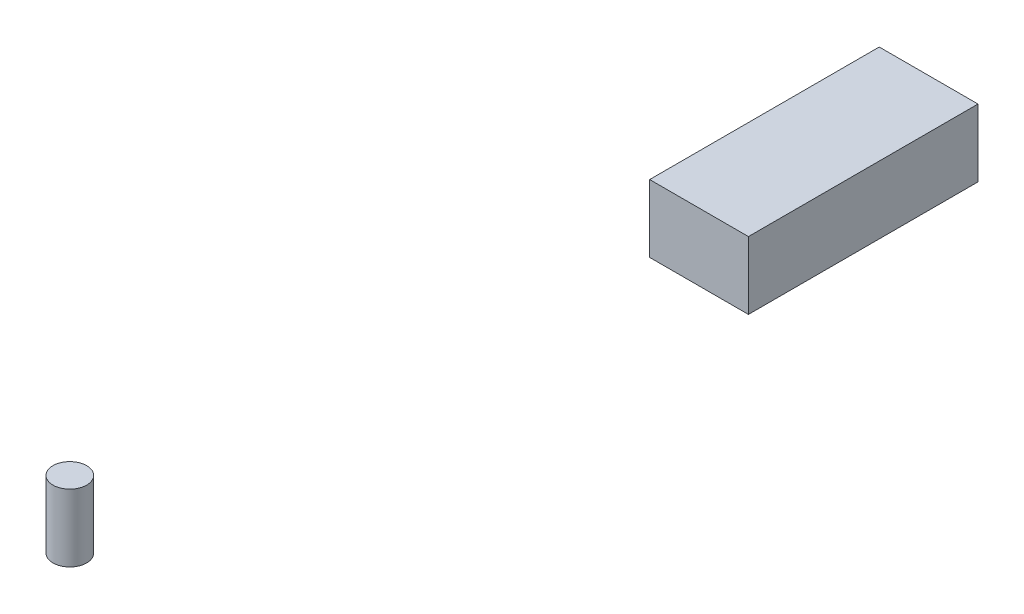
ISO-10303-21;
HEADER;
FILE_DESCRIPTION(('STEP AP214'),'2;1');
FILE_NAME('part.step','',(''),(''),'','','');
FILE_SCHEMA(('AUTOMOTIVE_DESIGN { 1 0 10303 214 1 1 1 1 }'));
ENDSEC;
DATA;
#1=APPLICATION_CONTEXT('core data for automotive mechanical design processes');
#2=APPLICATION_PROTOCOL_DEFINITION('international standard','automotive_design',2000,#1);
#3=PRODUCT_CONTEXT('',#1,'mechanical');
#4=PRODUCT('Part','Part','',(#3));
#5=PRODUCT_RELATED_PRODUCT_CATEGORY('part','',(#4));
#6=PRODUCT_DEFINITION_FORMATION('','',#4);
#7=PRODUCT_DEFINITION_CONTEXT('part definition',#1,'design');
#8=PRODUCT_DEFINITION('design','',#6,#7);
#9=PRODUCT_DEFINITION_SHAPE('','',#8);
#10=(LENGTH_UNIT() NAMED_UNIT(*) SI_UNIT(.MILLI.,.METRE.));
#11=(NAMED_UNIT(*) PLANE_ANGLE_UNIT() SI_UNIT($,.RADIAN.));
#12=(NAMED_UNIT(*) SI_UNIT($,.STERADIAN.) SOLID_ANGLE_UNIT());
#13=UNCERTAINTY_MEASURE_WITH_UNIT(LENGTH_MEASURE(1.E-05),#10,'distance_accuracy_value','');
#14=(GEOMETRIC_REPRESENTATION_CONTEXT(3) GLOBAL_UNCERTAINTY_ASSIGNED_CONTEXT((#13)) GLOBAL_UNIT_ASSIGNED_CONTEXT((#10,
#11,#12)) REPRESENTATION_CONTEXT('',''));
#15=CARTESIAN_POINT('',(0.,0.,0.));
#16=DIRECTION('',(0.,0.,1.));
#17=DIRECTION('',(1.,0.,0.));
#18=AXIS2_PLACEMENT_3D('',#15,#16,#17);
#19=CARTESIAN_POINT('',(19.6415192070973,10.,-114.995004291305));
#20=DIRECTION('',(-1.,0.,0.));
#21=DIRECTION('',(0.,0.,1.));
#22=AXIS2_PLACEMENT_3D('',#19,#20,#21);
#23=PLANE('',#22);
#24=DIRECTION('',(0.,0.,-1.));
#25=VECTOR('',#24,1.);
#26=CARTESIAN_POINT('',(19.6415192070973,0.,-114.995004291305));
#27=LINE('',#26,#25);
#28=CARTESIAN_POINT('',(19.6415192070973,0.,-80.9606812347664));
#29=VERTEX_POINT('',#28);
#30=CARTESIAN_POINT('',(19.6415192070973,0.,-114.995004291305));
#31=VERTEX_POINT('',#30);
#32=EDGE_CURVE('E109',#29,#31,#27,.T.);
#33=ORIENTED_EDGE('',*,*,#32,.T.);
#34=DIRECTION('',(0.,-1.,0.));
#35=VECTOR('',#34,1.);
#36=CARTESIAN_POINT('',(19.6415192070973,10.,-114.995004291305));
#37=LINE('',#36,#35);
#38=CARTESIAN_POINT('',(19.6415192070973,10.,-114.995004291305));
#39=VERTEX_POINT('',#38);
#40=EDGE_CURVE('E12',#39,#31,#37,.T.);
#41=ORIENTED_EDGE('',*,*,#40,.F.);
#42=DIRECTION('',(0.,0.,-1.));
#43=VECTOR('',#42,1.);
#44=CARTESIAN_POINT('',(19.6415192070973,10.,-114.995004291305));
#45=LINE('',#44,#43);
#46=CARTESIAN_POINT('',(19.6415192070973,10.,-80.9606812347664));
#47=VERTEX_POINT('',#46);
#48=EDGE_CURVE('E97',#47,#39,#45,.T.);
#49=ORIENTED_EDGE('',*,*,#48,.F.);
#50=DIRECTION('',(0.,-1.,0.));
#51=VECTOR('',#50,1.);
#52=CARTESIAN_POINT('',(19.6415192070973,10.,-80.9606812347664));
#53=LINE('',#52,#51);
#54=EDGE_CURVE('E105',#47,#29,#53,.T.);
#55=ORIENTED_EDGE('',*,*,#54,.T.);
#56=EDGE_LOOP('',(#33,#41,#49,#55));
#57=FACE_BOUND('',#56,.T.);
#58=ADVANCED_FACE('F46',(#57),#23,.F.);
#59=CARTESIAN_POINT('',(5.,10.,-114.995004291305));
#60=DIRECTION('',(0.,0.,1.));
#61=DIRECTION('',(1.,0.,0.));
#62=AXIS2_PLACEMENT_3D('',#59,#60,#61);
#63=PLANE('',#62);
#64=DIRECTION('',(-1.,0.,0.));
#65=VECTOR('',#64,1.);
#66=CARTESIAN_POINT('',(5.,0.,-114.995004291305));
#67=LINE('',#66,#65);
#68=CARTESIAN_POINT('',(5.,0.,-114.995004291305));
#69=VERTEX_POINT('',#68);
#70=EDGE_CURVE('E101',#31,#69,#67,.T.);
#71=ORIENTED_EDGE('',*,*,#70,.T.);
#72=DIRECTION('',(0.,-1.,0.));
#73=VECTOR('',#72,1.);
#74=CARTESIAN_POINT('',(5.,10.,-114.995004291305));
#75=LINE('',#74,#73);
#76=CARTESIAN_POINT('',(5.,10.,-114.995004291305));
#77=VERTEX_POINT('',#76);
#78=EDGE_CURVE('E54',#77,#69,#75,.T.);
#79=ORIENTED_EDGE('',*,*,#78,.F.);
#80=DIRECTION('',(-1.,0.,0.));
#81=VECTOR('',#80,1.);
#82=CARTESIAN_POINT('',(5.,10.,-114.995004291305));
#83=LINE('',#82,#81);
#84=EDGE_CURVE('E92',#39,#77,#83,.T.);
#85=ORIENTED_EDGE('',*,*,#84,.F.);
#86=ORIENTED_EDGE('',*,*,#40,.T.);
#87=EDGE_LOOP('',(#71,#79,#85,#86));
#88=FACE_BOUND('',#87,.T.);
#89=ADVANCED_FACE('F100',(#88),#63,.F.);
#90=CARTESIAN_POINT('',(5.,10.,-114.995004291305));
#91=DIRECTION('',(1.,0.,0.));
#92=DIRECTION('',(0.,0.,-1.));
#93=AXIS2_PLACEMENT_3D('',#90,#91,#92);
#94=PLANE('',#93);
#95=DIRECTION('',(0.,0.,1.));
#96=VECTOR('',#95,1.);
#97=CARTESIAN_POINT('',(5.,0.,-114.995004291305));
#98=LINE('',#97,#96);
#99=CARTESIAN_POINT('',(5.,0.,-80.9606812347664));
#100=VERTEX_POINT('',#99);
#101=EDGE_CURVE('E79',#69,#100,#98,.T.);
#102=ORIENTED_EDGE('',*,*,#101,.T.);
#103=DIRECTION('',(0.,-1.,0.));
#104=VECTOR('',#103,1.);
#105=CARTESIAN_POINT('',(5.,10.,-80.9606812347664));
#106=LINE('',#105,#104);
#107=CARTESIAN_POINT('',(5.,10.,-80.9606812347664));
#108=VERTEX_POINT('',#107);
#109=EDGE_CURVE('E102',#108,#100,#106,.T.);
#110=ORIENTED_EDGE('',*,*,#109,.F.);
#111=DIRECTION('',(0.,0.,1.));
#112=VECTOR('',#111,1.);
#113=CARTESIAN_POINT('',(5.,10.,-114.995004291305));
#114=LINE('',#113,#112);
#115=EDGE_CURVE('E95',#77,#108,#114,.T.);
#116=ORIENTED_EDGE('',*,*,#115,.F.);
#117=ORIENTED_EDGE('',*,*,#78,.T.);
#118=EDGE_LOOP('',(#102,#110,#116,#117));
#119=FACE_BOUND('',#118,.T.);
#120=ADVANCED_FACE('F103',(#119),#94,.F.);
#121=CARTESIAN_POINT('',(5.,10.,-80.9606812347664));
#122=DIRECTION('',(0.,0.,-1.));
#123=DIRECTION('',(-1.,0.,0.));
#124=AXIS2_PLACEMENT_3D('',#121,#122,#123);
#125=PLANE('',#124);
#126=DIRECTION('',(1.,0.,0.));
#127=VECTOR('',#126,1.);
#128=CARTESIAN_POINT('',(5.,0.,-80.9606812347664));
#129=LINE('',#128,#127);
#130=EDGE_CURVE('E85',#100,#29,#129,.T.);
#131=ORIENTED_EDGE('',*,*,#130,.T.);
#132=ORIENTED_EDGE('',*,*,#54,.F.);
#133=DIRECTION('',(1.,0.,0.));
#134=VECTOR('',#133,1.);
#135=CARTESIAN_POINT('',(5.,10.,-80.9606812347664));
#136=LINE('',#135,#134);
#137=EDGE_CURVE('E62',#108,#47,#136,.T.);
#138=ORIENTED_EDGE('',*,*,#137,.F.);
#139=ORIENTED_EDGE('',*,*,#109,.T.);
#140=EDGE_LOOP('',(#131,#132,#138,#139));
#141=FACE_BOUND('',#140,.T.);
#142=ADVANCED_FACE('F116',(#141),#125,.F.);
#143=CARTESIAN_POINT('',(0.,10.,0.));
#144=DIRECTION('',(0.,1.,0.));
#145=DIRECTION('',(0.,0.,1.));
#146=AXIS2_PLACEMENT_3D('',#143,#144,#145);
#147=PLANE('',#146);
#148=ORIENTED_EDGE('',*,*,#48,.T.);
#149=ORIENTED_EDGE('',*,*,#84,.T.);
#150=ORIENTED_EDGE('',*,*,#115,.T.);
#151=ORIENTED_EDGE('',*,*,#137,.T.);
#152=EDGE_LOOP('',(#148,#149,#150,#151));
#153=FACE_BOUND('',#152,.T.);
#154=ADVANCED_FACE('F93',(#153),#147,.T.);
#155=CARTESIAN_POINT('',(0.,0.,0.));
#156=DIRECTION('',(0.,1.,0.));
#157=DIRECTION('',(0.,0.,1.));
#158=AXIS2_PLACEMENT_3D('',#155,#156,#157);
#159=PLANE('',#158);
#160=ORIENTED_EDGE('',*,*,#32,.F.);
#161=ORIENTED_EDGE('',*,*,#130,.F.);
#162=ORIENTED_EDGE('',*,*,#101,.F.);
#163=ORIENTED_EDGE('',*,*,#70,.F.);
#164=EDGE_LOOP('',(#160,#161,#162,#163));
#165=FACE_BOUND('',#164,.T.);
#166=ADVANCED_FACE('F119',(#165),#159,.F.);
#167=CLOSED_SHELL('',(#58,#89,#120,#142,#154,#166));
#168=MANIFOLD_SOLID_BREP('B2_NOT_SHOWN',#167);
#169=CARTESIAN_POINT('',(0.,10.,0.));
#170=DIRECTION('',(0.,-1.,0.));
#171=DIRECTION('',(0.,0.,-1.));
#172=AXIS2_PLACEMENT_3D('',#169,#170,#171);
#173=CYLINDRICAL_SURFACE('',#172,2.5);
#174=CARTESIAN_POINT('',(0.,10.,0.));
#175=DIRECTION('',(0.,1.,0.));
#176=DIRECTION('',(0.,0.,1.));
#177=AXIS2_PLACEMENT_3D('',#174,#175,#176);
#178=CIRCLE('',#177,2.5);
#179=CARTESIAN_POINT('',(0.,10.,2.5));
#180=VERTEX_POINT('',#179);
#181=EDGE_CURVE('E45',#180,#180,#178,.T.);
#182=ORIENTED_EDGE('',*,*,#181,.F.);
#183=EDGE_LOOP('',(#182));
#184=FACE_BOUND('',#183,.T.);
#185=CARTESIAN_POINT('',(0.,0.,0.));
#186=DIRECTION('',(0.,1.,0.));
#187=DIRECTION('',(0.,0.,1.));
#188=AXIS2_PLACEMENT_3D('',#185,#186,#187);
#189=CIRCLE('',#188,2.5);
#190=CARTESIAN_POINT('',(0.,0.,2.5));
#191=VERTEX_POINT('',#190);
#192=EDGE_CURVE('E172',#191,#191,#189,.T.);
#193=ORIENTED_EDGE('',*,*,#192,.T.);
#194=EDGE_LOOP('',(#193));
#195=FACE_BOUND('',#194,.T.);
#196=ADVANCED_FACE('F169',(#184,#195),#173,.T.);
#197=CARTESIAN_POINT('',(0.,10.,0.));
#198=DIRECTION('',(0.,1.,0.));
#199=DIRECTION('',(0.,0.,1.));
#200=AXIS2_PLACEMENT_3D('',#197,#198,#199);
#201=PLANE('',#200);
#202=ORIENTED_EDGE('',*,*,#181,.T.);
#203=EDGE_LOOP('',(#202));
#204=FACE_BOUND('',#203,.T.);
#205=ADVANCED_FACE('F184',(#204),#201,.T.);
#206=CARTESIAN_POINT('',(0.,0.,0.));
#207=DIRECTION('',(0.,1.,0.));
#208=DIRECTION('',(0.,0.,1.));
#209=AXIS2_PLACEMENT_3D('',#206,#207,#208);
#210=PLANE('',#209);
#211=ORIENTED_EDGE('',*,*,#192,.F.);
#212=EDGE_LOOP('',(#211));
#213=FACE_BOUND('',#212,.T.);
#214=ADVANCED_FACE('F182',(#213),#210,.F.);
#215=CLOSED_SHELL('',(#196,#205,#214));
#216=MANIFOLD_SOLID_BREP('B6',#215);
#217=ADVANCED_BREP_SHAPE_REPRESENTATION('',(#18,#168,#216),#14);
#218=SHAPE_DEFINITION_REPRESENTATION(#9,#217);
ENDSEC;
END-ISO-10303-21;
